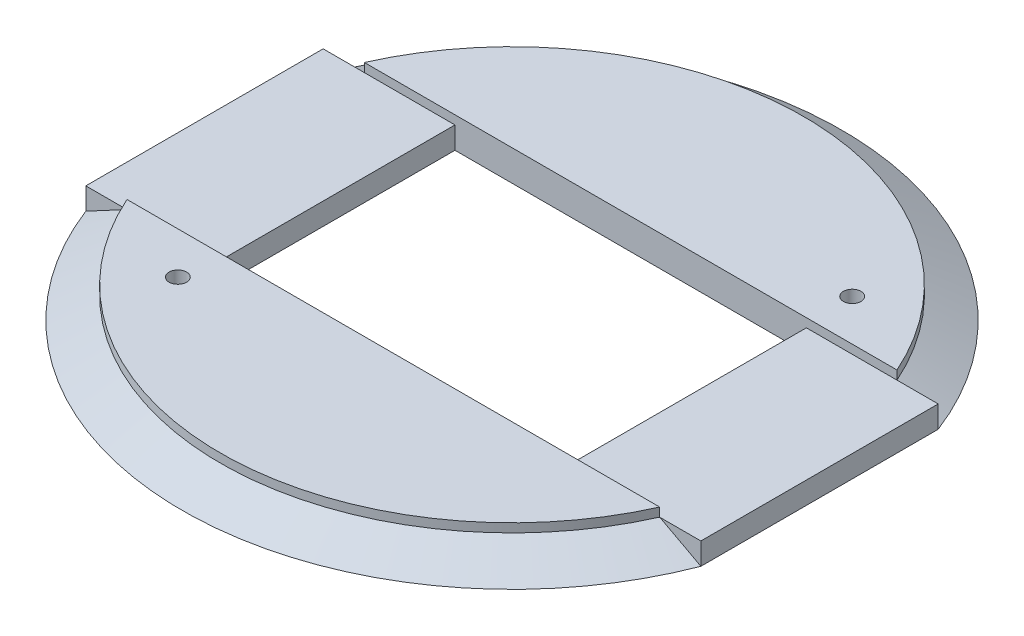
ISO-10303-21;
HEADER;
FILE_DESCRIPTION(('STEP AP214'),'2;1');
FILE_NAME('part.step','',(''),(''),'','','');
FILE_SCHEMA(('AUTOMOTIVE_DESIGN { 1 0 10303 214 1 1 1 1 }'));
ENDSEC;
DATA;
#1=APPLICATION_CONTEXT('core data for automotive mechanical design processes');
#2=APPLICATION_PROTOCOL_DEFINITION('international standard','automotive_design',2000,#1);
#3=PRODUCT_CONTEXT('',#1,'mechanical');
#4=PRODUCT('Part','Part','',(#3));
#5=PRODUCT_RELATED_PRODUCT_CATEGORY('part','',(#4));
#6=PRODUCT_DEFINITION_FORMATION('','',#4);
#7=PRODUCT_DEFINITION_CONTEXT('part definition',#1,'design');
#8=PRODUCT_DEFINITION('design','',#6,#7);
#9=PRODUCT_DEFINITION_SHAPE('','',#8);
#10=(LENGTH_UNIT() NAMED_UNIT(*) SI_UNIT(.MILLI.,.METRE.));
#11=(NAMED_UNIT(*) PLANE_ANGLE_UNIT() SI_UNIT($,.RADIAN.));
#12=(NAMED_UNIT(*) SI_UNIT($,.STERADIAN.) SOLID_ANGLE_UNIT());
#13=UNCERTAINTY_MEASURE_WITH_UNIT(LENGTH_MEASURE(1.E-05),#10,'distance_accuracy_value','');
#14=(GEOMETRIC_REPRESENTATION_CONTEXT(3) GLOBAL_UNCERTAINTY_ASSIGNED_CONTEXT((#13)) GLOBAL_UNIT_ASSIGNED_CONTEXT((#10,
#11,#12)) REPRESENTATION_CONTEXT('',''));
#15=CARTESIAN_POINT('',(0.,0.,0.));
#16=DIRECTION('',(0.,0.,1.));
#17=DIRECTION('',(1.,0.,0.));
#18=AXIS2_PLACEMENT_3D('',#15,#16,#17);
#19=CARTESIAN_POINT('',(-37.5000000000002,3.5,-13.5));
#20=DIRECTION('',(0.,0.,-1.));
#21=DIRECTION('',(-1.,0.,0.));
#22=AXIS2_PLACEMENT_3D('',#19,#20,#21);
#23=PLANE('',#22);
#24=DIRECTION('',(0.,-1.,0.));
#25=VECTOR('',#24,1.);
#26=CARTESIAN_POINT('',(-19.9872698795218,2.5,-13.5));
#27=LINE('',#26,#25);
#28=CARTESIAN_POINT('',(-19.9872698795218,2.5,-13.5));
#29=VERTEX_POINT('',#28);
#30=CARTESIAN_POINT('',(-19.9872698795218,0.,-13.5));
#31=VERTEX_POINT('',#30);
#32=EDGE_CURVE('E152',#29,#31,#27,.T.);
#33=ORIENTED_EDGE('',*,*,#32,.T.);
#34=DIRECTION('',(1.,0.,0.));
#35=VECTOR('',#34,1.);
#36=CARTESIAN_POINT('',(-37.5000000000002,0.,-13.5));
#37=LINE('',#36,#35);
#38=CARTESIAN_POINT('',(19.9888362052718,0.,-13.5));
#39=VERTEX_POINT('',#38);
#40=EDGE_CURVE('E208',#31,#39,#37,.T.);
#41=ORIENTED_EDGE('',*,*,#40,.T.);
#42=DIRECTION('',(0.,-1.,0.));
#43=VECTOR('',#42,1.);
#44=CARTESIAN_POINT('',(19.9888362052718,2.5,-13.5));
#45=LINE('',#44,#43);
#46=CARTESIAN_POINT('',(19.9888362052718,2.5,-13.5));
#47=VERTEX_POINT('',#46);
#48=EDGE_CURVE('E238',#47,#39,#45,.T.);
#49=ORIENTED_EDGE('',*,*,#48,.F.);
#50=DIRECTION('',(-1.,0.,0.));
#51=VECTOR('',#50,1.);
#52=CARTESIAN_POINT('',(-37.5000000000002,2.5,-13.5));
#53=LINE('',#52,#51);
#54=CARTESIAN_POINT('',(30.2994981692177,2.5,-13.5));
#55=VERTEX_POINT('',#54);
#56=EDGE_CURVE('E42',#55,#47,#53,.T.);
#57=ORIENTED_EDGE('',*,*,#56,.F.);
#58=DIRECTION('',(0.,-1.,0.));
#59=VECTOR('',#58,1.);
#60=CARTESIAN_POINT('',(30.2994981692177,3.5,-13.5));
#61=LINE('',#60,#59);
#62=CARTESIAN_POINT('',(30.2994981692177,3.5,-13.5));
#63=VERTEX_POINT('',#62);
#64=EDGE_CURVE('E211',#63,#55,#61,.T.);
#65=ORIENTED_EDGE('',*,*,#64,.F.);
#66=DIRECTION('',(-1.,0.,0.));
#67=VECTOR('',#66,1.);
#68=CARTESIAN_POINT('',(0.,3.5,-13.5));
#69=LINE('',#68,#67);
#70=CARTESIAN_POINT('',(-30.2994981692177,3.5,-13.5));
#71=VERTEX_POINT('',#70);
#72=EDGE_CURVE('E209',#63,#71,#69,.T.);
#73=ORIENTED_EDGE('',*,*,#72,.T.);
#74=DIRECTION('',(0.,-1.,0.));
#75=VECTOR('',#74,1.);
#76=CARTESIAN_POINT('',(-30.2994981692177,3.5,-13.5));
#77=LINE('',#76,#75);
#78=CARTESIAN_POINT('',(-30.2994981692177,2.5,-13.5));
#79=VERTEX_POINT('',#78);
#80=EDGE_CURVE('E213',#79,#71,#77,.F.);
#81=ORIENTED_EDGE('',*,*,#80,.F.);
#82=DIRECTION('',(-1.,0.,0.));
#83=VECTOR('',#82,1.);
#84=CARTESIAN_POINT('',(-34.9857113690718,2.5,-13.5));
#85=LINE('',#84,#83);
#86=EDGE_CURVE('E49',#29,#79,#85,.T.);
#87=ORIENTED_EDGE('',*,*,#86,.F.);
#88=EDGE_LOOP('',(#33,#41,#49,#57,#65,#73,#81,#87));
#89=FACE_BOUND('',#88,.T.);
#90=ADVANCED_FACE('F33',(#89),#23,.F.);
#91=CARTESIAN_POINT('',(-37.5000000000002,3.5,13.5));
#92=DIRECTION('',(0.,0.,1.));
#93=DIRECTION('',(1.,0.,0.));
#94=AXIS2_PLACEMENT_3D('',#91,#92,#93);
#95=PLANE('',#94);
#96=DIRECTION('',(0.,-1.,0.));
#97=VECTOR('',#96,1.);
#98=CARTESIAN_POINT('',(-19.9872698795218,2.5,13.5));
#99=LINE('',#98,#97);
#100=CARTESIAN_POINT('',(-19.9872698795218,2.5,13.5));
#101=VERTEX_POINT('',#100);
#102=CARTESIAN_POINT('',(-19.9872698795218,0.,13.5));
#103=VERTEX_POINT('',#102);
#104=EDGE_CURVE('E57',#101,#103,#99,.T.);
#105=ORIENTED_EDGE('',*,*,#104,.F.);
#106=DIRECTION('',(1.,0.,0.));
#107=VECTOR('',#106,1.);
#108=CARTESIAN_POINT('',(-37.5000000000002,2.5,13.5));
#109=LINE('',#108,#107);
#110=CARTESIAN_POINT('',(-30.2994981692177,2.5,13.5));
#111=VERTEX_POINT('',#110);
#112=EDGE_CURVE('E11',#111,#101,#109,.T.);
#113=ORIENTED_EDGE('',*,*,#112,.F.);
#114=DIRECTION('',(0.,-1.,0.));
#115=VECTOR('',#114,1.);
#116=CARTESIAN_POINT('',(-30.2994981692177,3.5,13.5));
#117=LINE('',#116,#115);
#118=CARTESIAN_POINT('',(-30.2994981692177,3.5,13.5));
#119=VERTEX_POINT('',#118);
#120=EDGE_CURVE('E165',#119,#111,#117,.T.);
#121=ORIENTED_EDGE('',*,*,#120,.F.);
#122=DIRECTION('',(1.,0.,0.));
#123=VECTOR('',#122,1.);
#124=CARTESIAN_POINT('',(0.,3.5,13.5));
#125=LINE('',#124,#123);
#126=CARTESIAN_POINT('',(30.2994981692177,3.5,13.5));
#127=VERTEX_POINT('',#126);
#128=EDGE_CURVE('E256',#119,#127,#125,.T.);
#129=ORIENTED_EDGE('',*,*,#128,.T.);
#130=DIRECTION('',(0.,-1.,0.));
#131=VECTOR('',#130,1.);
#132=CARTESIAN_POINT('',(30.2994981692177,3.5,13.5));
#133=LINE('',#132,#131);
#134=CARTESIAN_POINT('',(30.2994981692177,2.5,13.5));
#135=VERTEX_POINT('',#134);
#136=EDGE_CURVE('E150',#135,#127,#133,.F.);
#137=ORIENTED_EDGE('',*,*,#136,.F.);
#138=DIRECTION('',(-1.,0.,0.));
#139=VECTOR('',#138,1.);
#140=CARTESIAN_POINT('',(34.9857113690718,2.5,13.5));
#141=LINE('',#140,#139);
#142=CARTESIAN_POINT('',(19.9888362052718,2.5,13.5));
#143=VERTEX_POINT('',#142);
#144=EDGE_CURVE('E248',#135,#143,#141,.T.);
#145=ORIENTED_EDGE('',*,*,#144,.T.);
#146=DIRECTION('',(0.,-1.,0.));
#147=VECTOR('',#146,1.);
#148=CARTESIAN_POINT('',(19.9888362052718,2.5,13.5));
#149=LINE('',#148,#147);
#150=CARTESIAN_POINT('',(19.9888362052718,0.,13.5));
#151=VERTEX_POINT('',#150);
#152=EDGE_CURVE('E241',#143,#151,#149,.T.);
#153=ORIENTED_EDGE('',*,*,#152,.T.);
#154=DIRECTION('',(-1.,0.,0.));
#155=VECTOR('',#154,1.);
#156=CARTESIAN_POINT('',(-37.5000000000002,0.,13.5));
#157=LINE('',#156,#155);
#158=EDGE_CURVE('E148',#151,#103,#157,.T.);
#159=ORIENTED_EDGE('',*,*,#158,.T.);
#160=EDGE_LOOP('',(#105,#113,#121,#129,#137,#145,#153,#159));
#161=FACE_BOUND('',#160,.T.);
#162=ADVANCED_FACE('F171',(#161),#95,.F.);
#163=CARTESIAN_POINT('',(0.,0.,0.));
#164=DIRECTION('',(0.,-1.,0.));
#165=DIRECTION('',(0.,0.,-1.));
#166=AXIS2_PLACEMENT_3D('',#163,#164,#165);
#167=CONICAL_SURFACE('',#166,37.5,1.04709334954053);
#168=CARTESIAN_POINT('',(82.5251930594109,-26.6350217304059,-13.5));
#169=CARTESIAN_POINT('',(80.7566849360586,-25.6271440249869,-13.5));
#170=CARTESIAN_POINT('',(78.9878295189754,-24.6198749917179,-13.5));
#171=CARTESIAN_POINT('',(75.449230831006,-22.6068930401471,-13.5));
#172=CARTESIAN_POINT('',(73.679487559098,-21.6011801236417,-13.5));
#173=CARTESIAN_POINT('',(70.138785731053,-19.5915730399164,-13.5));
#174=CARTESIAN_POINT('',(68.3678270908053,-18.587679020858,-13.5));
#175=CARTESIAN_POINT('',(64.8245640189606,-16.5822704047367,-13.5));
#176=CARTESIAN_POINT('',(63.0522595880748,-15.5807558064173,-13.5));
#177=CARTESIAN_POINT('',(59.5106863776902,-13.5834289327205,-13.5));
#178=CARTESIAN_POINT('',(57.7414221605202,-12.587608570052,-13.5));
#179=CARTESIAN_POINT('',(54.2006990439848,-10.5998772191572,-13.5));
#180=CARTESIAN_POINT('',(52.429240145752,-9.60796622891428,-13.5));
#181=CARTESIAN_POINT('',(48.8835067583843,-7.62939881746756,-13.5));
#182=CARTESIAN_POINT('',(47.1092324165161,-6.64274213247121,-13.5));
#183=CARTESIAN_POINT('',(43.5567508763857,-4.67653641181451,-13.5));
#184=CARTESIAN_POINT('',(41.7785436906795,-3.69698735350488,-13.5));
#185=CARTESIAN_POINT('',(39.0992798885915,-2.23100982748631,-13.5));
#186=CARTESIAN_POINT('',(38.2002927447997,-1.74079951898514,-13.5));
#187=CARTESIAN_POINT('',(36.4006063163136,-0.763533073353689,-13.5));
#188=CARTESIAN_POINT('',(35.4999070341194,-0.276476931622296,-13.5));
#189=CARTESIAN_POINT('',(33.6963352336786,0.693818089988859,-13.5));
#190=CARTESIAN_POINT('',(32.7934625039614,1.17705657707111,-13.5));
#191=CARTESIAN_POINT('',(30.985154946481,2.13871355041323,-13.5));
#192=CARTESIAN_POINT('',(30.0797201264031,2.61713205111189,-13.5));
#193=CARTESIAN_POINT('',(28.2633790335123,3.56906591251843,-13.5));
#194=CARTESIAN_POINT('',(27.3524647357012,4.04256598381133,-13.5));
#195=CARTESIAN_POINT('',(25.5265547454915,4.98167522692284,-13.5));
#196=CARTESIAN_POINT('',(24.6115589911218,5.44728427840874,-13.5));
#197=CARTESIAN_POINT('',(22.7765042168052,6.36805536555745,-13.5));
#198=CARTESIAN_POINT('',(21.856446105325,6.82321920443785,-13.5));
#199=CARTESIAN_POINT('',(20.4712713613247,7.49545250100073,-13.5));
#200=CARTESIAN_POINT('',(20.0087039096735,7.71777567289421,-13.5));
#201=CARTESIAN_POINT('',(19.0816112770663,8.1582983894775,-13.5));
#202=CARTESIAN_POINT('',(18.617086111483,8.37649796647389,-13.5));
#203=CARTESIAN_POINT('',(17.6669400418984,8.81677619520719,-13.5));
#204=CARTESIAN_POINT('',(17.1812261508178,9.03865450434057,-13.5));
#205=CARTESIAN_POINT('',(16.206981918199,9.4761281914342,-13.5));
#206=CARTESIAN_POINT('',(15.7184516272581,9.69172368184802,-13.5));
#207=CARTESIAN_POINT('',(14.737968765965,10.1154217557455,-13.5));
#208=CARTESIAN_POINT('',(14.2460152053906,10.3235220536616,-13.5));
#209=CARTESIAN_POINT('',(13.2583217568681,10.7305587923816,-13.5));
#210=CARTESIAN_POINT('',(12.7625818843661,10.9294952705454,-13.5));
#211=CARTESIAN_POINT('',(11.7679567371934,11.3157301706048,-13.5));
#212=CARTESIAN_POINT('',(11.2690820401723,11.5030557117766,-13.5));
#213=CARTESIAN_POINT('',(10.2663967783731,11.8641204070768,-13.5));
#214=CARTESIAN_POINT('',(9.7625860363956,12.0378590714234,-13.5));
#215=CARTESIAN_POINT('',(8.74964118029443,12.3686435053434,-13.5));
#216=CARTESIAN_POINT('',(8.24050882632424,12.5256946137831,-13.5));
#217=CARTESIAN_POINT('',(7.21648228635561,12.8195043635871,-13.5));
#218=CARTESIAN_POINT('',(6.70158875148473,12.9562652737236,-13.5));
#219=CARTESIAN_POINT('',(5.44805732520423,13.2576940139058,-13.5));
#220=CARTESIAN_POINT('',(4.70630260949486,13.409946218305,-13.5));
#221=CARTESIAN_POINT('',(3.58634481963095,13.5919923022503,-13.5));
#222=CARTESIAN_POINT('',(3.21183857570799,13.644949616132,-13.5));
#223=CARTESIAN_POINT('',(2.46080601406756,13.7341196087279,-13.5));
#224=CARTESIAN_POINT('',(2.08427970711821,13.7703323766108,-13.5));
#225=CARTESIAN_POINT('',(1.33167496013264,13.8248568557013,-13.5));
#226=CARTESIAN_POINT('',(0.955602487176428,13.8432504939362,-13.5));
#227=CARTESIAN_POINT('',(0.203008500115449,13.8618826030145,-13.5));
#228=CARTESIAN_POINT('',(-0.173513007486739,13.8621213336461,-13.5));
#229=CARTESIAN_POINT('',(-0.926169599444824,13.8444336839333,-13.5));
#230=CARTESIAN_POINT('',(-1.30230463517431,13.8265052450439,-13.5));
#231=CARTESIAN_POINT('',(-2.05331656948637,13.7730191615984,-13.5));
#232=CARTESIAN_POINT('',(-2.42819341093263,13.73746072706,-13.5));
#233=CARTESIAN_POINT('',(-3.31767550294701,13.6330604644278,-13.5));
#234=CARTESIAN_POINT('',(-3.83140644432463,13.5567125946993,-13.5));
#235=CARTESIAN_POINT('',(-4.85389356799293,13.3759097345542,-13.5));
#236=CARTESIAN_POINT('',(-5.3626489057718,13.2714500556538,-13.5));
#237=CARTESIAN_POINT('',(-6.3750368000123,13.0383733129956,-13.5));
#238=CARTESIAN_POINT('',(-6.87866414838331,12.9097338578923,-13.5));
#239=CARTESIAN_POINT('',(-7.88026889393695,12.6323024494827,-13.5));
#240=CARTESIAN_POINT('',(-8.37824644809318,12.4835110575703,-13.5));
#241=CARTESIAN_POINT('',(-9.37495825983987,12.1673574169046,-13.5));
#242=CARTESIAN_POINT('',(-9.87362694170061,11.999789849881,-13.5));
#243=CARTESIAN_POINT('',(-10.8660201890356,11.6506792367781,-13.5));
#244=CARTESIAN_POINT('',(-11.3597447394344,11.4691361480997,-13.5));
#245=CARTESIAN_POINT('',(-12.3425621754969,11.094697836458,-13.5));
#246=CARTESIAN_POINT('',(-12.8316573227157,10.9018085281374,-13.5));
#247=CARTESIAN_POINT('',(-13.562416321813,10.6054245623871,-13.5));
#248=CARTESIAN_POINT('',(-13.8055197489485,10.5054558854224,-13.5));
#249=CARTESIAN_POINT('',(-14.2908338316407,10.303375983132,-13.5));
#250=CARTESIAN_POINT('',(-14.5330444900492,10.2012647646576,-13.5));
#251=CARTESIAN_POINT('',(-15.3312332469784,9.86098150244903,-13.5));
#252=CARTESIAN_POINT('',(-15.8854349748745,9.61863680854456,-13.5));
#253=CARTESIAN_POINT('',(-16.9901359441583,9.12563431876892,-13.5));
#254=CARTESIAN_POINT('',(-17.5406350542097,8.87497622986302,-13.5));
#255=CARTESIAN_POINT('',(-18.6385585975036,8.36684030602248,-13.5));
#256=CARTESIAN_POINT('',(-19.1859826224563,8.109361590272,-13.5));
#257=CARTESIAN_POINT('',(-20.2781538258117,7.58881405845458,-13.5));
#258=CARTESIAN_POINT('',(-20.8229010350365,7.32574530694036,-13.5));
#259=CARTESIAN_POINT('',(-21.9103779048048,6.79483342682024,-13.5));
#260=CARTESIAN_POINT('',(-22.4531064983683,6.5269881152375,-13.5));
#261=CARTESIAN_POINT('',(-23.5366180674857,5.98738794662057,-13.5));
#262=CARTESIAN_POINT('',(-24.0774010321165,5.71563306768027,-13.5));
#263=CARTESIAN_POINT('',(-25.6971755577603,4.89547936410613,-13.5));
#264=CARTESIAN_POINT('',(-26.7736720162719,4.34215254208244,-13.5));
#265=CARTESIAN_POINT('',(-28.9230863191859,3.22520044695516,-13.5));
#266=CARTESIAN_POINT('',(-29.9959976160646,2.66156261563206,-13.5));
#267=CARTESIAN_POINT('',(-32.1380069619788,1.52705821441855,-13.5));
#268=CARTESIAN_POINT('',(-33.2071049569699,0.956191542594335,-13.5));
#269=CARTESIAN_POINT('',(-35.3420286936618,-0.19093249994572,-13.5));
#270=CARTESIAN_POINT('',(-36.4078552424307,-0.767188370390411,-13.5));
#271=CARTESIAN_POINT('',(-38.5371400357089,-1.92404445185904,-13.5));
#272=CARTESIAN_POINT('',(-39.6005982910822,-2.50464464290084,-13.5));
#273=CARTESIAN_POINT('',(-41.7201291439431,-3.66630436914956,-13.5));
#274=CARTESIAN_POINT('',(-42.7762115273169,-4.24734605933377,-13.5));
#275=CARTESIAN_POINT('',(-44.8868394925227,-5.41221522923893,-13.5));
#276=CARTESIAN_POINT('',(-45.9413850727773,-5.99604271181682,-13.5));
#277=CARTESIAN_POINT('',(-49.1032708617467,-7.7510063773214,-13.5));
#278=CARTESIAN_POINT('',(-51.2087210940705,-8.92554739559778,-13.5));
#279=CARTESIAN_POINT('',(-55.4147776398796,-11.2801973718071,-13.5));
#280=CARTESIAN_POINT('',(-57.5153861548418,-12.4603024021832,-13.5));
#281=CARTESIAN_POINT('',(-61.713987474622,-14.825073350518,-13.5));
#282=CARTESIAN_POINT('',(-63.8119803224635,-16.0097391921126,-13.5));
#283=CARTESIAN_POINT('',(-67.2938302632058,-17.9795783251102,-13.5));
#284=CARTESIAN_POINT('',(-68.6782345112151,-18.7637850109331,-13.5));
#285=CARTESIAN_POINT('',(-71.4464951762431,-20.3335496762824,-13.5));
#286=CARTESIAN_POINT('',(-72.8303515081009,-21.119107805991,-13.5));
#287=CARTESIAN_POINT('',(-75.5997522083312,-22.6925849716365,-13.5));
#288=CARTESIAN_POINT('',(-76.985295579093,-23.4805057631358,-13.5));
#289=CARTESIAN_POINT('',(-79.7556959929888,-25.0571647545834,-13.5));
#290=CARTESIAN_POINT('',(-81.1405530987382,-25.8459028445034,-13.5));
#291=CARTESIAN_POINT('',(-82.5251930594109,-26.6350217304059,-13.5));
#292=B_SPLINE_CURVE_WITH_KNOTS('',3,(#168,#169,#170,#171,#172,#173,#174,#175,#176,#177,#178,
#179,#180,#181,#182,#183,#184,#185,#186,#187,#188,#189,#190,#191,#192,#193,#194,#195,#196,#197,
#198,#199,#200,#201,#202,#203,#204,#205,#206,#207,#208,#209,#210,#211,#212,#213,#214,#215,#216,
#217,#218,#219,#220,#221,#222,#223,#224,#225,#226,#227,#228,#229,#230,#231,#232,#233,#234,#235,
#236,#237,#238,#239,#240,#241,#242,#243,#244,#245,#246,#247,#248,#249,#250,#251,#252,#253,#254,
#255,#256,#257,#258,#259,#260,#261,#262,#263,#264,#265,#266,#267,#268,#269,#270,#271,#272,#273,
#274,#275,#276,#277,#278,#279,#280,#281,#282,#283,#284,#285,#286,#287,#288,#289,#290,#291),
.UNSPECIFIED.,.F.,.F.,(4,2,2,2,2,2,2,2,2,2,2,2,2,2,2,2,2,2,2,2,2,2,2,2,2,2,2,2,2,2,2,2,2,2,2,2,
2,2,2,2,2,2,2,2,2,2,2,2,2,2,2,2,2,2,2,2,2,2,2,2,2,4),(0.,6.10663173169998,12.2132705081044,
18.3203861597067,24.4274985854597,30.5182737744648,36.6090458215158,42.6995091425893,
48.7899530471581,51.8618134866694,54.9336694441229,58.0058374519738,61.0779962540817,
64.1578529018104,67.2377564730866,70.3171242807995,71.856772483836,73.3964086193925,
74.9983490176921,76.6002607258897,78.2026568516276,79.8050464439945,81.4035402024973,
83.0020915572144,84.6001299360836,86.1979894935367,88.4671687826526,89.6015546341337,
90.7359344446751,91.8650736087206,92.9941966153049,94.1234475785547,95.2527491469734,
96.8099284571841,98.3673676346676,99.9262562265996,101.485101399857,103.063058437225,
104.641020284581,106.21816672704,107.006725032219,107.795280816151,109.60980201148,
111.424387234083,113.239207945767,115.054007711611,116.869659283482,118.685321032792,
122.316379621602,125.952201797054,129.588075298407,133.222965093983,136.857838180781,
140.473946321504,144.090058171496,151.322757743963,158.55094840602,165.779018564521,
170.55227653715,175.326104509209,180.107834641795,184.888988149583),.UNSPECIFIED.);
#293=CARTESIAN_POINT('',(34.9857113690718,0.,-13.5));
#294=VERTEX_POINT('',#293);
#295=EDGE_CURVE('E210',#294,#55,#292,.T.);
#296=ORIENTED_EDGE('',*,*,#295,.F.);
#297=CARTESIAN_POINT('',(0.,0.,0.));
#298=DIRECTION('',(0.,-1.,0.));
#299=DIRECTION('',(0.,0.,-1.));
#300=AXIS2_PLACEMENT_3D('',#297,#298,#299);
#301=CIRCLE('',#300,37.5);
#302=CARTESIAN_POINT('',(-34.9857113690718,0.,-13.5));
#303=VERTEX_POINT('',#302);
#304=EDGE_CURVE('E219',#303,#294,#301,.T.);
#305=ORIENTED_EDGE('',*,*,#304,.F.);
#306=EDGE_CURVE('E201',#79,#303,#292,.T.);
#307=ORIENTED_EDGE('',*,*,#306,.F.);
#308=CARTESIAN_POINT('',(0.,2.5,0.));
#309=DIRECTION('',(0.,1.,0.));
#310=DIRECTION('',(0.,0.,1.));
#311=AXIS2_PLACEMENT_3D('',#308,#309,#310);
#312=CIRCLE('',#311,33.1709148096104);
#313=EDGE_CURVE('E217',#55,#79,#312,.T.);
#314=ORIENTED_EDGE('',*,*,#313,.F.);
#315=EDGE_LOOP('',(#296,#305,#307,#314));
#316=FACE_BOUND('',#315,.T.);
#317=ADVANCED_FACE('F35',(#316),#167,.T.);
#318=CARTESIAN_POINT('',(0.,0.,0.));
#319=DIRECTION('',(0.,-1.,0.));
#320=DIRECTION('',(0.,0.,-1.));
#321=AXIS2_PLACEMENT_3D('',#318,#319,#320);
#322=PLANE('',#321);
#323=CARTESIAN_POINT('',(-19.7570768472701,0.,18.2565626738409));
#324=DIRECTION('',(0.,1.,0.));
#325=DIRECTION('',(0.,0.,1.));
#326=AXIS2_PLACEMENT_3D('',#323,#324,#325);
#327=CIRCLE('',#326,0.999251596362607);
#328=CARTESIAN_POINT('',(-19.7570768472701,0.,19.2558142702035));
#329=VERTEX_POINT('',#328);
#330=EDGE_CURVE('E305',#329,#329,#327,.T.);
#331=ORIENTED_EDGE('',*,*,#330,.T.);
#332=EDGE_LOOP('',(#331));
#333=FACE_BOUND('',#332,.T.);
#334=CARTESIAN_POINT('',(20.4975295540351,0.,-18.200406751788));
#335=DIRECTION('',(0.,1.,0.));
#336=DIRECTION('',(0.,0.,1.));
#337=AXIS2_PLACEMENT_3D('',#334,#335,#336);
#338=CIRCLE('',#337,1.00037182338103);
#339=CARTESIAN_POINT('',(20.4975295540351,0.,-17.200034928407));
#340=VERTEX_POINT('',#339);
#341=EDGE_CURVE('E470',#340,#340,#338,.T.);
#342=ORIENTED_EDGE('',*,*,#341,.T.);
#343=EDGE_LOOP('',(#342));
#344=FACE_BOUND('',#343,.T.);
#345=ORIENTED_EDGE('',*,*,#40,.F.);
#346=DIRECTION('',(0.,0.,-1.));
#347=VECTOR('',#346,1.);
#348=CARTESIAN_POINT('',(-19.9872698795218,0.,13.5));
#349=LINE('',#348,#347);
#350=EDGE_CURVE('E143',#103,#31,#349,.T.);
#351=ORIENTED_EDGE('',*,*,#350,.F.);
#352=ORIENTED_EDGE('',*,*,#158,.F.);
#353=DIRECTION('',(0.,0.,-1.));
#354=VECTOR('',#353,1.);
#355=CARTESIAN_POINT('',(19.9888362052718,0.,13.5));
#356=LINE('',#355,#354);
#357=EDGE_CURVE('E253',#151,#39,#356,.T.);
#358=ORIENTED_EDGE('',*,*,#357,.T.);
#359=EDGE_LOOP('',(#345,#351,#352,#358));
#360=FACE_BOUND('',#359,.T.);
#361=DIRECTION('',(0.,0.,1.));
#362=VECTOR('',#361,1.);
#363=CARTESIAN_POINT('',(-34.9857113690718,0.,13.5));
#364=LINE('',#363,#362);
#365=CARTESIAN_POINT('',(-34.9857113690718,0.,13.5));
#366=VERTEX_POINT('',#365);
#367=EDGE_CURVE('E147',#303,#366,#364,.T.);
#368=ORIENTED_EDGE('',*,*,#367,.F.);
#369=ORIENTED_EDGE('',*,*,#304,.T.);
#370=DIRECTION('',(0.,0.,-1.));
#371=VECTOR('',#370,1.);
#372=CARTESIAN_POINT('',(34.9857113690718,0.,13.5));
#373=LINE('',#372,#371);
#374=CARTESIAN_POINT('',(34.9857113690718,0.,13.5));
#375=VERTEX_POINT('',#374);
#376=EDGE_CURVE('E255',#375,#294,#373,.T.);
#377=ORIENTED_EDGE('',*,*,#376,.F.);
#378=CARTESIAN_POINT('',(0.,0.,0.));
#379=DIRECTION('',(0.,-1.,0.));
#380=DIRECTION('',(0.,0.,-1.));
#381=AXIS2_PLACEMENT_3D('',#378,#379,#380);
#382=CIRCLE('',#381,37.5);
#383=EDGE_CURVE('E281',#375,#366,#382,.T.);
#384=ORIENTED_EDGE('',*,*,#383,.T.);
#385=EDGE_LOOP('',(#368,#369,#377,#384));
#386=FACE_BOUND('',#385,.T.);
#387=ADVANCED_FACE('F280',(#333,#344,#360,#386),#322,.T.);
#388=CARTESIAN_POINT('',(0.,3.5,0.));
#389=DIRECTION('',(0.,-1.,0.));
#390=DIRECTION('',(0.,0.,-1.));
#391=AXIS2_PLACEMENT_3D('',#388,#389,#390);
#392=CYLINDRICAL_SURFACE('',#391,33.1709148096104);
#393=CARTESIAN_POINT('',(0.,3.5,0.));
#394=DIRECTION('',(0.,1.,0.));
#395=DIRECTION('',(0.,0.,1.));
#396=AXIS2_PLACEMENT_3D('',#393,#394,#395);
#397=CIRCLE('',#396,33.1709148096104);
#398=EDGE_CURVE('E216',#63,#71,#397,.T.);
#399=ORIENTED_EDGE('',*,*,#398,.F.);
#400=ORIENTED_EDGE('',*,*,#64,.T.);
#401=ORIENTED_EDGE('',*,*,#313,.T.);
#402=ORIENTED_EDGE('',*,*,#80,.T.);
#403=EDGE_LOOP('',(#399,#400,#401,#402));
#404=FACE_BOUND('',#403,.T.);
#405=ADVANCED_FACE('F316',(#404),#392,.T.);
#406=CARTESIAN_POINT('',(0.,3.5,0.));
#407=DIRECTION('',(0.,1.,0.));
#408=DIRECTION('',(0.,0.,1.));
#409=AXIS2_PLACEMENT_3D('',#406,#407,#408);
#410=PLANE('',#409);
#411=CARTESIAN_POINT('',(20.4975295540351,3.5,-18.200406751788));
#412=DIRECTION('',(0.,1.,0.));
#413=DIRECTION('',(0.,0.,1.));
#414=AXIS2_PLACEMENT_3D('',#411,#412,#413);
#415=CIRCLE('',#414,1.00037182338103);
#416=CARTESIAN_POINT('',(20.4975295540351,3.5,-17.200034928407));
#417=VERTEX_POINT('',#416);
#418=EDGE_CURVE('E325',#417,#417,#415,.T.);
#419=ORIENTED_EDGE('',*,*,#418,.F.);
#420=EDGE_LOOP('',(#419));
#421=FACE_BOUND('',#420,.T.);
#422=ORIENTED_EDGE('',*,*,#72,.F.);
#423=ORIENTED_EDGE('',*,*,#398,.T.);
#424=EDGE_LOOP('',(#422,#423));
#425=FACE_BOUND('',#424,.T.);
#426=ADVANCED_FACE('F198',(#421,#425),#410,.T.);
#427=CARTESIAN_POINT('',(34.9857113690718,2.5,13.5));
#428=DIRECTION('',(0.,0.,1.));
#429=DIRECTION('',(1.,0.,0.));
#430=AXIS2_PLACEMENT_3D('',#427,#428,#429);
#431=PLANE('',#430);
#432=CARTESIAN_POINT('',(-82.5251930594109,-26.6350217304059,13.5));
#433=CARTESIAN_POINT('',(-80.7566849360586,-25.6271440249869,13.5));
#434=CARTESIAN_POINT('',(-78.9878295189754,-24.6198749917179,13.5));
#435=CARTESIAN_POINT('',(-75.449230831006,-22.6068930401471,13.5));
#436=CARTESIAN_POINT('',(-73.679487559098,-21.6011801236417,13.5));
#437=CARTESIAN_POINT('',(-70.138785731053,-19.5915730399164,13.5));
#438=CARTESIAN_POINT('',(-68.3678270908053,-18.587679020858,13.5));
#439=CARTESIAN_POINT('',(-64.8245640189606,-16.5822704047367,13.5));
#440=CARTESIAN_POINT('',(-63.0522595880748,-15.5807558064173,13.5));
#441=CARTESIAN_POINT('',(-59.5106863776902,-13.5834289327205,13.5));
#442=CARTESIAN_POINT('',(-57.7414221605202,-12.587608570052,13.5));
#443=CARTESIAN_POINT('',(-54.2006990439848,-10.5998772191572,13.5));
#444=CARTESIAN_POINT('',(-52.429240145752,-9.60796622891428,13.5));
#445=CARTESIAN_POINT('',(-48.8835067583843,-7.62939881746756,13.5));
#446=CARTESIAN_POINT('',(-47.1092324165161,-6.64274213247121,13.5));
#447=CARTESIAN_POINT('',(-43.5567508763857,-4.67653641181451,13.5));
#448=CARTESIAN_POINT('',(-41.7785436906795,-3.69698735350487,13.5));
#449=CARTESIAN_POINT('',(-39.0992798885915,-2.2310098274863,13.5));
#450=CARTESIAN_POINT('',(-38.2002927447997,-1.74079951898513,13.5));
#451=CARTESIAN_POINT('',(-36.4006063163136,-0.763533073353681,13.5));
#452=CARTESIAN_POINT('',(-35.4999070341194,-0.276476931622288,13.5));
#453=CARTESIAN_POINT('',(-33.6963352336786,0.693818089988865,13.5));
#454=CARTESIAN_POINT('',(-32.7934625039614,1.17705657707111,13.5));
#455=CARTESIAN_POINT('',(-30.9851549464809,2.13871355041323,13.5));
#456=CARTESIAN_POINT('',(-30.0797201264031,2.61713205111189,13.5));
#457=CARTESIAN_POINT('',(-28.2633790335123,3.56906591251844,13.5));
#458=CARTESIAN_POINT('',(-27.3524647357012,4.04256598381133,13.5));
#459=CARTESIAN_POINT('',(-25.5265547454915,4.98167522692284,13.5));
#460=CARTESIAN_POINT('',(-24.6115589911217,5.44728427840875,13.5));
#461=CARTESIAN_POINT('',(-22.7765042168052,6.36805536555745,13.5));
#462=CARTESIAN_POINT('',(-21.856446105325,6.82321920443785,13.5));
#463=CARTESIAN_POINT('',(-20.4712713613247,7.49545250100074,13.5));
#464=CARTESIAN_POINT('',(-20.0087039096735,7.71777567289421,13.5));
#465=CARTESIAN_POINT('',(-19.0816112770663,8.1582983894775,13.5));
#466=CARTESIAN_POINT('',(-18.617086111483,8.37649796647389,13.5));
#467=CARTESIAN_POINT('',(-17.6669400418984,8.81677619520719,13.5));
#468=CARTESIAN_POINT('',(-17.1812261508178,9.03865450434057,13.5));
#469=CARTESIAN_POINT('',(-16.206981918199,9.4761281914342,13.5));
#470=CARTESIAN_POINT('',(-15.7184516272581,9.69172368184802,13.5));
#471=CARTESIAN_POINT('',(-14.737968765965,10.1154217557455,13.5));
#472=CARTESIAN_POINT('',(-14.2460152053906,10.3235220536616,13.5));
#473=CARTESIAN_POINT('',(-13.2583217568681,10.7305587923816,13.5));
#474=CARTESIAN_POINT('',(-12.7625818843661,10.9294952705454,13.5));
#475=CARTESIAN_POINT('',(-11.7679567371934,11.3157301706048,13.5));
#476=CARTESIAN_POINT('',(-11.2690820401724,11.5030557117766,13.5));
#477=CARTESIAN_POINT('',(-10.2663967783731,11.8641204070768,13.5));
#478=CARTESIAN_POINT('',(-9.76258603639561,12.0378590714234,13.5));
#479=CARTESIAN_POINT('',(-8.74964118029444,12.3686435053434,13.5));
#480=CARTESIAN_POINT('',(-8.24050882632424,12.5256946137831,13.5));
#481=CARTESIAN_POINT('',(-7.21648228635562,12.8195043635871,13.5));
#482=CARTESIAN_POINT('',(-6.70158875148474,12.9562652737236,13.5));
#483=CARTESIAN_POINT('',(-5.44805732520424,13.2576940139058,13.5));
#484=CARTESIAN_POINT('',(-4.70630260949487,13.409946218305,13.5));
#485=CARTESIAN_POINT('',(-3.58634481963096,13.5919923022503,13.5));
#486=CARTESIAN_POINT('',(-3.21183857570801,13.644949616132,13.5));
#487=CARTESIAN_POINT('',(-2.46080601406758,13.7341196087279,13.5));
#488=CARTESIAN_POINT('',(-2.08427970711823,13.7703323766108,13.5));
#489=CARTESIAN_POINT('',(-1.33167496013266,13.8248568557013,13.5));
#490=CARTESIAN_POINT('',(-0.955602487176447,13.8432504939362,13.5));
#491=CARTESIAN_POINT('',(-0.203008500115467,13.8618826030145,13.5));
#492=CARTESIAN_POINT('',(0.173513007486721,13.8621213336461,13.5));
#493=CARTESIAN_POINT('',(0.926169599444807,13.8444336839333,13.5));
#494=CARTESIAN_POINT('',(1.30230463517429,13.8265052450439,13.5));
#495=CARTESIAN_POINT('',(2.05331656948635,13.7730191615984,13.5));
#496=CARTESIAN_POINT('',(2.42819341093262,13.73746072706,13.5));
#497=CARTESIAN_POINT('',(3.31767550294699,13.6330604644278,13.5));
#498=CARTESIAN_POINT('',(3.83140644432462,13.5567125946993,13.5));
#499=CARTESIAN_POINT('',(4.85389356799292,13.3759097345542,13.5));
#500=CARTESIAN_POINT('',(5.36264890577179,13.2714500556538,13.5));
#501=CARTESIAN_POINT('',(6.37503680001228,13.0383733129956,13.5));
#502=CARTESIAN_POINT('',(6.87866414838328,12.9097338578923,13.5));
#503=CARTESIAN_POINT('',(7.88026889393692,12.6323024494827,13.5));
#504=CARTESIAN_POINT('',(8.37824644809315,12.4835110575703,13.5));
#505=CARTESIAN_POINT('',(9.37495825983984,12.1673574169046,13.5));
#506=CARTESIAN_POINT('',(9.87362694170058,11.999789849881,13.5));
#507=CARTESIAN_POINT('',(10.8660201890356,11.6506792367781,13.5));
#508=CARTESIAN_POINT('',(11.3597447394344,11.4691361480997,13.5));
#509=CARTESIAN_POINT('',(12.3425621754968,11.0946978364581,13.5));
#510=CARTESIAN_POINT('',(12.8316573227157,10.9018085281374,13.5));
#511=CARTESIAN_POINT('',(13.5624163218129,10.6054245623871,13.5));
#512=CARTESIAN_POINT('',(13.8055197489485,10.5054558854225,13.5));
#513=CARTESIAN_POINT('',(14.2908338316406,10.303375983132,13.5));
#514=CARTESIAN_POINT('',(14.5330444900492,10.2012647646577,13.5));
#515=CARTESIAN_POINT('',(15.3312332469783,9.86098150244905,13.5));
#516=CARTESIAN_POINT('',(15.8854349748745,9.61863680854458,13.5));
#517=CARTESIAN_POINT('',(16.9901359441582,9.12563431876895,13.5));
#518=CARTESIAN_POINT('',(17.5406350542097,8.87497622986304,13.5));
#519=CARTESIAN_POINT('',(18.6385585975035,8.36684030602251,13.5));
#520=CARTESIAN_POINT('',(19.1859826224562,8.10936159027203,13.5));
#521=CARTESIAN_POINT('',(20.2781538258117,7.58881405845461,13.5));
#522=CARTESIAN_POINT('',(20.8229010350365,7.32574530694039,13.5));
#523=CARTESIAN_POINT('',(21.9103779048048,6.79483342682027,13.5));
#524=CARTESIAN_POINT('',(22.4531064983683,6.52698811523753,13.5));
#525=CARTESIAN_POINT('',(23.5366180674856,5.9873879466206,13.5));
#526=CARTESIAN_POINT('',(24.0774010321164,5.7156330676803,13.5));
#527=CARTESIAN_POINT('',(25.6971755577602,4.89547936410616,13.5));
#528=CARTESIAN_POINT('',(26.7736720162718,4.34215254208248,13.5));
#529=CARTESIAN_POINT('',(28.9230863191858,3.22520044695519,13.5));
#530=CARTESIAN_POINT('',(29.9959976160646,2.66156261563209,13.5));
#531=CARTESIAN_POINT('',(32.1380069619787,1.52705821441858,13.5));
#532=CARTESIAN_POINT('',(33.2071049569698,0.956191542594371,13.5));
#533=CARTESIAN_POINT('',(35.3420286936618,-0.19093249994568,13.5));
#534=CARTESIAN_POINT('',(36.4078552424307,-0.767188370390373,13.5));
#535=CARTESIAN_POINT('',(38.5371400357088,-1.924044451859,13.5));
#536=CARTESIAN_POINT('',(39.6005982910821,-2.5046446429008,13.5));
#537=CARTESIAN_POINT('',(41.720129143943,-3.66630436914951,13.5));
#538=CARTESIAN_POINT('',(42.7762115273168,-4.24734605933373,13.5));
#539=CARTESIAN_POINT('',(44.8868394925226,-5.41221522923889,13.5));
#540=CARTESIAN_POINT('',(45.9413850727772,-5.99604271181678,13.5));
#541=CARTESIAN_POINT('',(49.1032708617466,-7.75100637732135,13.5));
#542=CARTESIAN_POINT('',(51.2087210940705,-8.92554739559772,13.5));
#543=CARTESIAN_POINT('',(55.4147776398795,-11.280197371807,13.5));
#544=CARTESIAN_POINT('',(57.5153861548417,-12.4603024021831,13.5));
#545=CARTESIAN_POINT('',(61.7139874746219,-14.8250733505179,13.5));
#546=CARTESIAN_POINT('',(63.8119803224634,-16.0097391921125,13.5));
#547=CARTESIAN_POINT('',(67.2938302632057,-17.9795783251101,13.5));
#548=CARTESIAN_POINT('',(68.678234511215,-18.763785010933,13.5));
#549=CARTESIAN_POINT('',(71.446495176243,-20.3335496762823,13.5));
#550=CARTESIAN_POINT('',(72.8303515081009,-21.119107805991,13.5));
#551=CARTESIAN_POINT('',(75.5997522083311,-22.6925849716365,13.5));
#552=CARTESIAN_POINT('',(76.9852955790929,-23.4805057631358,13.5));
#553=CARTESIAN_POINT('',(79.7556959929887,-25.0571647545834,13.5));
#554=CARTESIAN_POINT('',(81.1405530987382,-25.8459028445034,13.5));
#555=CARTESIAN_POINT('',(82.5251930594109,-26.6350217304059,13.5));
#556=B_SPLINE_CURVE_WITH_KNOTS('',3,(#432,#433,#434,#435,#436,#437,#438,#439,#440,#441,#442,
#443,#444,#445,#446,#447,#448,#449,#450,#451,#452,#453,#454,#455,#456,#457,#458,#459,#460,#461,
#462,#463,#464,#465,#466,#467,#468,#469,#470,#471,#472,#473,#474,#475,#476,#477,#478,#479,#480,
#481,#482,#483,#484,#485,#486,#487,#488,#489,#490,#491,#492,#493,#494,#495,#496,#497,#498,#499,
#500,#501,#502,#503,#504,#505,#506,#507,#508,#509,#510,#511,#512,#513,#514,#515,#516,#517,#518,
#519,#520,#521,#522,#523,#524,#525,#526,#527,#528,#529,#530,#531,#532,#533,#534,#535,#536,#537,
#538,#539,#540,#541,#542,#543,#544,#545,#546,#547,#548,#549,#550,#551,#552,#553,#554,#555),
.UNSPECIFIED.,.F.,.F.,(4,2,2,2,2,2,2,2,2,2,2,2,2,2,2,2,2,2,2,2,2,2,2,2,2,2,2,2,2,2,2,2,2,2,2,2,
2,2,2,2,2,2,2,2,2,2,2,2,2,2,2,2,2,2,2,2,2,2,2,2,2,4),(0.,6.10663173169998,12.2132705081044,
18.3203861597067,24.4274985854597,30.5182737744648,36.6090458215158,42.6995091425893,
48.7899530471581,51.8618134866694,54.9336694441229,58.0058374519738,61.0779962540817,
64.1578529018105,67.2377564730866,70.3171242807995,71.856772483836,73.3964086193925,
74.9983490176921,76.6002607258897,78.2026568516276,79.8050464439945,81.4035402024973,
83.0020915572144,84.6001299360836,86.1979894935367,88.4671687826526,89.6015546341337,
90.7359344446751,91.8650736087205,92.9941966153049,94.1234475785546,95.2527491469733,
96.8099284571841,98.3673676346676,99.9262562265995,101.485101399857,103.063058437225,
104.641020284581,106.21816672704,107.006725032219,107.795280816151,109.60980201148,
111.424387234083,113.239207945767,115.054007711611,116.869659283482,118.685321032792,
122.316379621602,125.952201797054,129.588075298406,133.222965093983,136.857838180781,
140.473946321504,144.090058171496,151.322757743963,158.55094840602,165.779018564521,
170.552276537149,175.326104509209,180.107834641795,184.888988149583),.UNSPECIFIED.);
#557=EDGE_CURVE('E158',#135,#375,#556,.T.);
#558=ORIENTED_EDGE('',*,*,#557,.T.);
#559=DIRECTION('',(0.,-1.,0.));
#560=VECTOR('',#559,1.);
#561=CARTESIAN_POINT('',(34.9857113690718,2.5,13.5));
#562=LINE('',#561,#560);
#563=CARTESIAN_POINT('',(34.9857113690718,2.5,13.5));
#564=VERTEX_POINT('',#563);
#565=EDGE_CURVE('E221',#564,#375,#562,.T.);
#566=ORIENTED_EDGE('',*,*,#565,.F.);
#567=EDGE_CURVE('E243',#564,#135,#141,.T.);
#568=ORIENTED_EDGE('',*,*,#567,.T.);
#569=EDGE_LOOP('',(#558,#566,#568));
#570=FACE_BOUND('',#569,.T.);
#571=ADVANCED_FACE('F196',(#570),#431,.T.);
#572=CARTESIAN_POINT('',(34.9857113690718,2.5,13.5));
#573=DIRECTION('',(-1.,0.,0.));
#574=DIRECTION('',(0.,0.,1.));
#575=AXIS2_PLACEMENT_3D('',#572,#573,#574);
#576=PLANE('',#575);
#577=ORIENTED_EDGE('',*,*,#376,.T.);
#578=DIRECTION('',(0.,-1.,0.));
#579=VECTOR('',#578,1.);
#580=CARTESIAN_POINT('',(34.9857113690718,2.5,-13.5));
#581=LINE('',#580,#579);
#582=CARTESIAN_POINT('',(34.9857113690718,2.5,-13.5));
#583=VERTEX_POINT('',#582);
#584=EDGE_CURVE('E261',#583,#294,#581,.T.);
#585=ORIENTED_EDGE('',*,*,#584,.F.);
#586=DIRECTION('',(0.,0.,-1.));
#587=VECTOR('',#586,1.);
#588=CARTESIAN_POINT('',(34.9857113690718,2.5,13.5));
#589=LINE('',#588,#587);
#590=EDGE_CURVE('E245',#564,#583,#589,.T.);
#591=ORIENTED_EDGE('',*,*,#590,.F.);
#592=ORIENTED_EDGE('',*,*,#565,.T.);
#593=EDGE_LOOP('',(#577,#585,#591,#592));
#594=FACE_BOUND('',#593,.T.);
#595=ADVANCED_FACE('F276',(#594),#576,.F.);
#596=CARTESIAN_POINT('',(34.9857113690718,2.5,-13.5));
#597=DIRECTION('',(0.,0.,1.));
#598=DIRECTION('',(1.,0.,0.));
#599=AXIS2_PLACEMENT_3D('',#596,#597,#598);
#600=PLANE('',#599);
#601=ORIENTED_EDGE('',*,*,#295,.T.);
#602=DIRECTION('',(-1.,0.,0.));
#603=VECTOR('',#602,1.);
#604=CARTESIAN_POINT('',(34.9857113690718,2.5,-13.5));
#605=LINE('',#604,#603);
#606=EDGE_CURVE('E233',#583,#55,#605,.T.);
#607=ORIENTED_EDGE('',*,*,#606,.F.);
#608=ORIENTED_EDGE('',*,*,#584,.T.);
#609=EDGE_LOOP('',(#601,#607,#608));
#610=FACE_BOUND('',#609,.T.);
#611=ADVANCED_FACE('F269',(#610),#600,.F.);
#612=CARTESIAN_POINT('',(19.9888362052718,2.5,13.5));
#613=DIRECTION('',(-1.,0.,0.));
#614=DIRECTION('',(0.,0.,1.));
#615=AXIS2_PLACEMENT_3D('',#612,#613,#614);
#616=PLANE('',#615);
#617=ORIENTED_EDGE('',*,*,#357,.F.);
#618=ORIENTED_EDGE('',*,*,#152,.F.);
#619=DIRECTION('',(0.,0.,-1.));
#620=VECTOR('',#619,1.);
#621=CARTESIAN_POINT('',(19.9888362052718,2.5,13.5));
#622=LINE('',#621,#620);
#623=EDGE_CURVE('E230',#143,#47,#622,.T.);
#624=ORIENTED_EDGE('',*,*,#623,.T.);
#625=ORIENTED_EDGE('',*,*,#48,.T.);
#626=EDGE_LOOP('',(#617,#618,#624,#625));
#627=FACE_BOUND('',#626,.T.);
#628=ADVANCED_FACE('F237',(#627),#616,.T.);
#629=CARTESIAN_POINT('',(0.,2.5,0.));
#630=DIRECTION('',(0.,-1.,0.));
#631=DIRECTION('',(0.,0.,-1.));
#632=AXIS2_PLACEMENT_3D('',#629,#630,#631);
#633=PLANE('',#632);
#634=ORIENTED_EDGE('',*,*,#567,.F.);
#635=ORIENTED_EDGE('',*,*,#590,.T.);
#636=ORIENTED_EDGE('',*,*,#606,.T.);
#637=ORIENTED_EDGE('',*,*,#56,.T.);
#638=ORIENTED_EDGE('',*,*,#623,.F.);
#639=ORIENTED_EDGE('',*,*,#144,.F.);
#640=EDGE_LOOP('',(#634,#635,#636,#637,#638,#639));
#641=FACE_BOUND('',#640,.T.);
#642=ADVANCED_FACE('F180',(#641),#633,.F.);
#643=CARTESIAN_POINT('',(0.,3.5,0.));
#644=DIRECTION('',(0.,1.,0.));
#645=DIRECTION('',(0.,0.,1.));
#646=AXIS2_PLACEMENT_3D('',#643,#644,#645);
#647=PLANE('',#646);
#648=CARTESIAN_POINT('',(-19.7570768472701,3.5,18.2565626738409));
#649=DIRECTION('',(0.,1.,0.));
#650=DIRECTION('',(0.,0.,1.));
#651=AXIS2_PLACEMENT_3D('',#648,#649,#650);
#652=CIRCLE('',#651,0.999251596362607);
#653=CARTESIAN_POINT('',(-19.7570768472701,3.5,19.2558142702035));
#654=VERTEX_POINT('',#653);
#655=EDGE_CURVE('E472',#654,#654,#652,.T.);
#656=ORIENTED_EDGE('',*,*,#655,.F.);
#657=EDGE_LOOP('',(#656));
#658=FACE_BOUND('',#657,.T.);
#659=ORIENTED_EDGE('',*,*,#128,.F.);
#660=CARTESIAN_POINT('',(0.,3.5,0.));
#661=DIRECTION('',(0.,1.,0.));
#662=DIRECTION('',(0.,0.,1.));
#663=AXIS2_PLACEMENT_3D('',#660,#661,#662);
#664=CIRCLE('',#663,33.1709148096104);
#665=EDGE_CURVE('E285',#119,#127,#664,.T.);
#666=ORIENTED_EDGE('',*,*,#665,.T.);
#667=EDGE_LOOP('',(#659,#666));
#668=FACE_BOUND('',#667,.T.);
#669=ADVANCED_FACE('F177',(#658,#668),#647,.T.);
#670=CARTESIAN_POINT('',(0.,3.5,0.));
#671=DIRECTION('',(0.,-1.,0.));
#672=DIRECTION('',(0.,0.,-1.));
#673=AXIS2_PLACEMENT_3D('',#670,#671,#672);
#674=CYLINDRICAL_SURFACE('',#673,33.1709148096104);
#675=ORIENTED_EDGE('',*,*,#665,.F.);
#676=ORIENTED_EDGE('',*,*,#120,.T.);
#677=CARTESIAN_POINT('',(0.,2.5,0.));
#678=DIRECTION('',(0.,1.,0.));
#679=DIRECTION('',(0.,0.,1.));
#680=AXIS2_PLACEMENT_3D('',#677,#678,#679);
#681=CIRCLE('',#680,33.1709148096104);
#682=EDGE_CURVE('E288',#111,#135,#681,.T.);
#683=ORIENTED_EDGE('',*,*,#682,.T.);
#684=ORIENTED_EDGE('',*,*,#136,.T.);
#685=EDGE_LOOP('',(#675,#676,#683,#684));
#686=FACE_BOUND('',#685,.T.);
#687=ADVANCED_FACE('F179',(#686),#674,.T.);
#688=CARTESIAN_POINT('',(0.,0.,0.));
#689=DIRECTION('',(0.,-1.,0.));
#690=DIRECTION('',(0.,0.,-1.));
#691=AXIS2_PLACEMENT_3D('',#688,#689,#690);
#692=CONICAL_SURFACE('',#691,37.5,1.04709334954053);
#693=EDGE_CURVE('E131',#366,#111,#556,.T.);
#694=ORIENTED_EDGE('',*,*,#693,.F.);
#695=ORIENTED_EDGE('',*,*,#383,.F.);
#696=ORIENTED_EDGE('',*,*,#557,.F.);
#697=ORIENTED_EDGE('',*,*,#682,.F.);
#698=EDGE_LOOP('',(#694,#695,#696,#697));
#699=FACE_BOUND('',#698,.T.);
#700=ADVANCED_FACE('F167',(#699),#692,.T.);
#701=CARTESIAN_POINT('',(-34.9857113690718,2.5,13.5));
#702=DIRECTION('',(1.,0.,0.));
#703=DIRECTION('',(0.,0.,-1.));
#704=AXIS2_PLACEMENT_3D('',#701,#702,#703);
#705=PLANE('',#704);
#706=ORIENTED_EDGE('',*,*,#367,.T.);
#707=DIRECTION('',(0.,-1.,0.));
#708=VECTOR('',#707,1.);
#709=CARTESIAN_POINT('',(-34.9857113690718,2.5,13.5));
#710=LINE('',#709,#708);
#711=CARTESIAN_POINT('',(-34.9857113690718,2.5,13.5));
#712=VERTEX_POINT('',#711);
#713=EDGE_CURVE('E128',#712,#366,#710,.T.);
#714=ORIENTED_EDGE('',*,*,#713,.F.);
#715=DIRECTION('',(0.,0.,1.));
#716=VECTOR('',#715,1.);
#717=CARTESIAN_POINT('',(-34.9857113690718,2.5,13.5));
#718=LINE('',#717,#716);
#719=CARTESIAN_POINT('',(-34.9857113690718,2.5,-13.5));
#720=VERTEX_POINT('',#719);
#721=EDGE_CURVE('E134',#720,#712,#718,.T.);
#722=ORIENTED_EDGE('',*,*,#721,.F.);
#723=DIRECTION('',(0.,-1.,0.));
#724=VECTOR('',#723,1.);
#725=CARTESIAN_POINT('',(-34.9857113690718,2.5,-13.5));
#726=LINE('',#725,#724);
#727=EDGE_CURVE('E303',#720,#303,#726,.T.);
#728=ORIENTED_EDGE('',*,*,#727,.T.);
#729=EDGE_LOOP('',(#706,#714,#722,#728));
#730=FACE_BOUND('',#729,.T.);
#731=ADVANCED_FACE('F145',(#730),#705,.F.);
#732=CARTESIAN_POINT('',(-34.9857113690718,2.5,13.5));
#733=DIRECTION('',(0.,0.,-1.));
#734=DIRECTION('',(-1.,0.,0.));
#735=AXIS2_PLACEMENT_3D('',#732,#733,#734);
#736=PLANE('',#735);
#737=ORIENTED_EDGE('',*,*,#693,.T.);
#738=DIRECTION('',(1.,0.,0.));
#739=VECTOR('',#738,1.);
#740=CARTESIAN_POINT('',(-34.9857113690718,2.5,13.5));
#741=LINE('',#740,#739);
#742=EDGE_CURVE('E124',#712,#111,#741,.T.);
#743=ORIENTED_EDGE('',*,*,#742,.F.);
#744=ORIENTED_EDGE('',*,*,#713,.T.);
#745=EDGE_LOOP('',(#737,#743,#744));
#746=FACE_BOUND('',#745,.T.);
#747=ADVANCED_FACE('F126',(#746),#736,.F.);
#748=CARTESIAN_POINT('',(-19.9872698795218,2.5,13.5));
#749=DIRECTION('',(-1.,0.,0.));
#750=DIRECTION('',(0.,0.,1.));
#751=AXIS2_PLACEMENT_3D('',#748,#749,#750);
#752=PLANE('',#751);
#753=ORIENTED_EDGE('',*,*,#350,.T.);
#754=ORIENTED_EDGE('',*,*,#32,.F.);
#755=DIRECTION('',(0.,0.,-1.));
#756=VECTOR('',#755,1.);
#757=CARTESIAN_POINT('',(-19.9872698795218,2.5,13.5));
#758=LINE('',#757,#756);
#759=EDGE_CURVE('E133',#101,#29,#758,.T.);
#760=ORIENTED_EDGE('',*,*,#759,.F.);
#761=ORIENTED_EDGE('',*,*,#104,.T.);
#762=EDGE_LOOP('',(#753,#754,#760,#761));
#763=FACE_BOUND('',#762,.T.);
#764=ADVANCED_FACE('F298',(#763),#752,.F.);
#765=CARTESIAN_POINT('',(-34.9857113690718,2.5,-13.5));
#766=DIRECTION('',(0.,0.,1.));
#767=DIRECTION('',(1.,0.,0.));
#768=AXIS2_PLACEMENT_3D('',#765,#766,#767);
#769=PLANE('',#768);
#770=ORIENTED_EDGE('',*,*,#306,.T.);
#771=ORIENTED_EDGE('',*,*,#727,.F.);
#772=EDGE_CURVE('E139',#79,#720,#85,.T.);
#773=ORIENTED_EDGE('',*,*,#772,.F.);
#774=EDGE_LOOP('',(#770,#771,#773));
#775=FACE_BOUND('',#774,.T.);
#776=ADVANCED_FACE('F328',(#775),#769,.F.);
#777=CARTESIAN_POINT('',(0.,2.5,0.));
#778=DIRECTION('',(0.,-1.,0.));
#779=DIRECTION('',(0.,0.,-1.));
#780=AXIS2_PLACEMENT_3D('',#777,#778,#779);
#781=PLANE('',#780);
#782=ORIENTED_EDGE('',*,*,#721,.T.);
#783=ORIENTED_EDGE('',*,*,#742,.T.);
#784=ORIENTED_EDGE('',*,*,#112,.T.);
#785=ORIENTED_EDGE('',*,*,#759,.T.);
#786=ORIENTED_EDGE('',*,*,#86,.T.);
#787=ORIENTED_EDGE('',*,*,#772,.T.);
#788=EDGE_LOOP('',(#782,#783,#784,#785,#786,#787));
#789=FACE_BOUND('',#788,.T.);
#790=ADVANCED_FACE('F137',(#789),#781,.F.);
#791=CARTESIAN_POINT('',(-19.7570768472701,0.,18.2565626738409));
#792=DIRECTION('',(0.,1.,0.));
#793=DIRECTION('',(0.,0.,1.));
#794=AXIS2_PLACEMENT_3D('',#791,#792,#793);
#795=CYLINDRICAL_SURFACE('',#794,0.999251596362607);
#796=ORIENTED_EDGE('',*,*,#330,.F.);
#797=EDGE_LOOP('',(#796));
#798=FACE_BOUND('',#797,.T.);
#799=ORIENTED_EDGE('',*,*,#655,.T.);
#800=EDGE_LOOP('',(#799));
#801=FACE_BOUND('',#800,.T.);
#802=ADVANCED_FACE('F335',(#798,#801),#795,.F.);
#803=CARTESIAN_POINT('',(20.4975295540351,0.,-18.200406751788));
#804=DIRECTION('',(0.,1.,0.));
#805=DIRECTION('',(0.,0.,1.));
#806=AXIS2_PLACEMENT_3D('',#803,#804,#805);
#807=CYLINDRICAL_SURFACE('',#806,1.00037182338103);
#808=ORIENTED_EDGE('',*,*,#341,.F.);
#809=EDGE_LOOP('',(#808));
#810=FACE_BOUND('',#809,.T.);
#811=ORIENTED_EDGE('',*,*,#418,.T.);
#812=EDGE_LOOP('',(#811));
#813=FACE_BOUND('',#812,.T.);
#814=ADVANCED_FACE('F453',(#810,#813),#807,.F.);
#815=CLOSED_SHELL('',(#90,#162,#317,#387,#405,#426,#571,#595,#611,#628,#642,#669,#687,#700,#731,
#747,#764,#776,#790,#802,#814));
#816=MANIFOLD_SOLID_BREP('B2',#815);
#817=ADVANCED_BREP_SHAPE_REPRESENTATION('',(#18,#816),#14);
#818=SHAPE_DEFINITION_REPRESENTATION(#9,#817);
ENDSEC;
END-ISO-10303-21;
